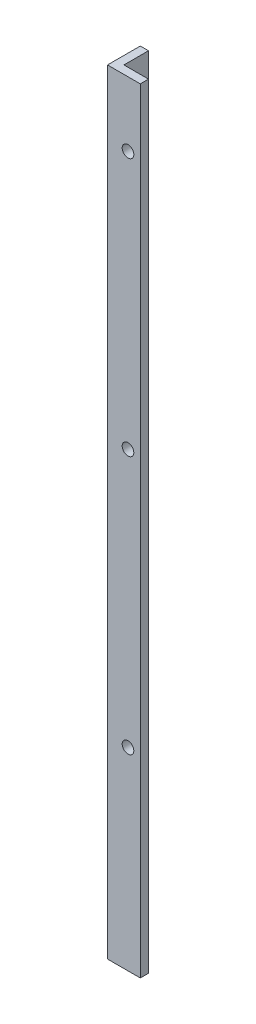
ISO-10303-21;
HEADER;
FILE_DESCRIPTION(('STEP AP214'),'2;1');
FILE_NAME('part.step','',(''),(''),'','','');
FILE_SCHEMA(('AUTOMOTIVE_DESIGN { 1 0 10303 214 1 1 1 1 }'));
ENDSEC;
DATA;
#1=APPLICATION_CONTEXT('core data for automotive mechanical design processes');
#2=APPLICATION_PROTOCOL_DEFINITION('international standard','automotive_design',2000,#1);
#3=PRODUCT_CONTEXT('',#1,'mechanical');
#4=PRODUCT('Part','Part','',(#3));
#5=PRODUCT_RELATED_PRODUCT_CATEGORY('part','',(#4));
#6=PRODUCT_DEFINITION_FORMATION('','',#4);
#7=PRODUCT_DEFINITION_CONTEXT('part definition',#1,'design');
#8=PRODUCT_DEFINITION('design','',#6,#7);
#9=PRODUCT_DEFINITION_SHAPE('','',#8);
#10=(LENGTH_UNIT() NAMED_UNIT(*) SI_UNIT(.MILLI.,.METRE.));
#11=(NAMED_UNIT(*) PLANE_ANGLE_UNIT() SI_UNIT($,.RADIAN.));
#12=(NAMED_UNIT(*) SI_UNIT($,.STERADIAN.) SOLID_ANGLE_UNIT());
#13=UNCERTAINTY_MEASURE_WITH_UNIT(LENGTH_MEASURE(1.E-05),#10,'distance_accuracy_value','');
#14=(GEOMETRIC_REPRESENTATION_CONTEXT(3) GLOBAL_UNCERTAINTY_ASSIGNED_CONTEXT((#13)) GLOBAL_UNIT_ASSIGNED_CONTEXT((#10,
#11,#12)) REPRESENTATION_CONTEXT('',''));
#15=CARTESIAN_POINT('',(0.,0.,0.));
#16=DIRECTION('',(0.,0.,1.));
#17=DIRECTION('',(1.,0.,0.));
#18=AXIS2_PLACEMENT_3D('',#15,#16,#17);
#19=CARTESIAN_POINT('',(0.,300.,0.));
#20=DIRECTION('',(1.,0.,0.));
#21=DIRECTION('',(0.,0.,-1.));
#22=AXIS2_PLACEMENT_3D('',#19,#20,#21);
#23=PLANE('',#22);
#24=CARTESIAN_POINT('',(0.,253.6,-7.94));
#25=DIRECTION('',(-1.,0.,0.));
#26=DIRECTION('',(0.,0.,1.));
#27=AXIS2_PLACEMENT_3D('',#24,#25,#26);
#28=CIRCLE('',#27,1.85000000000001);
#29=CARTESIAN_POINT('',(0.,253.6,-6.08999999999998));
#30=VERTEX_POINT('',#29);
#31=EDGE_CURVE('E178',#30,#30,#28,.T.);
#32=ORIENTED_EDGE('',*,*,#31,.F.);
#33=EDGE_LOOP('',(#32));
#34=FACE_BOUND('',#33,.T.);
#35=CARTESIAN_POINT('',(0.,225.,-7.94000000000001));
#36=DIRECTION('',(1.,0.,0.));
#37=DIRECTION('',(0.,0.,-1.));
#38=AXIS2_PLACEMENT_3D('',#35,#36,#37);
#39=CIRCLE('',#38,2.25);
#40=CARTESIAN_POINT('',(0.,225.,-10.19));
#41=VERTEX_POINT('',#40);
#42=EDGE_CURVE('E182',#41,#41,#39,.T.);
#43=ORIENTED_EDGE('',*,*,#42,.T.);
#44=EDGE_LOOP('',(#43));
#45=FACE_BOUND('',#44,.T.);
#46=CARTESIAN_POINT('',(0.,125.,-7.94000000000001));
#47=DIRECTION('',(1.,0.,0.));
#48=DIRECTION('',(0.,0.,-1.));
#49=AXIS2_PLACEMENT_3D('',#46,#47,#48);
#50=CIRCLE('',#49,2.25);
#51=CARTESIAN_POINT('',(0.,125.,-10.19));
#52=VERTEX_POINT('',#51);
#53=EDGE_CURVE('E186',#52,#52,#50,.T.);
#54=ORIENTED_EDGE('',*,*,#53,.T.);
#55=EDGE_LOOP('',(#54));
#56=FACE_BOUND('',#55,.T.);
#57=CARTESIAN_POINT('',(0.,25.,-7.94000000000001));
#58=DIRECTION('',(1.,0.,0.));
#59=DIRECTION('',(0.,0.,-1.));
#60=AXIS2_PLACEMENT_3D('',#57,#58,#59);
#61=CIRCLE('',#60,2.25);
#62=CARTESIAN_POINT('',(0.,25.,-10.19));
#63=VERTEX_POINT('',#62);
#64=EDGE_CURVE('E189',#63,#63,#61,.T.);
#65=ORIENTED_EDGE('',*,*,#64,.T.);
#66=EDGE_LOOP('',(#65));
#67=FACE_BOUND('',#66,.T.);
#68=DIRECTION('',(0.,0.,1.));
#69=VECTOR('',#68,1.);
#70=CARTESIAN_POINT('',(0.,0.,0.));
#71=LINE('',#70,#69);
#72=CARTESIAN_POINT('',(0.,0.,-12.7));
#73=VERTEX_POINT('',#72);
#74=CARTESIAN_POINT('',(0.,0.,0.));
#75=VERTEX_POINT('',#74);
#76=EDGE_CURVE('E130',#73,#75,#71,.T.);
#77=ORIENTED_EDGE('',*,*,#76,.T.);
#78=DIRECTION('',(0.,-1.,0.));
#79=VECTOR('',#78,1.);
#80=CARTESIAN_POINT('',(0.,300.,0.));
#81=LINE('',#80,#79);
#82=CARTESIAN_POINT('',(0.,300.,0.));
#83=VERTEX_POINT('',#82);
#84=EDGE_CURVE('E11',#83,#75,#81,.T.);
#85=ORIENTED_EDGE('',*,*,#84,.F.);
#86=DIRECTION('',(0.,0.,1.));
#87=VECTOR('',#86,1.);
#88=CARTESIAN_POINT('',(0.,300.,0.));
#89=LINE('',#88,#87);
#90=CARTESIAN_POINT('',(0.,300.,-12.7));
#91=VERTEX_POINT('',#90);
#92=EDGE_CURVE('E141',#91,#83,#89,.T.);
#93=ORIENTED_EDGE('',*,*,#92,.F.);
#94=DIRECTION('',(0.,-1.,0.));
#95=VECTOR('',#94,1.);
#96=CARTESIAN_POINT('',(0.,300.,-12.7));
#97=LINE('',#96,#95);
#98=EDGE_CURVE('E126',#91,#73,#97,.T.);
#99=ORIENTED_EDGE('',*,*,#98,.T.);
#100=EDGE_LOOP('',(#77,#85,#93,#99));
#101=FACE_BOUND('',#100,.T.);
#102=ADVANCED_FACE('F45',(#34,#45,#56,#67,#101),#23,.F.);
#103=CARTESIAN_POINT('',(0.,300.,0.));
#104=DIRECTION('',(0.,0.,-1.));
#105=DIRECTION('',(-1.,0.,0.));
#106=AXIS2_PLACEMENT_3D('',#103,#104,#105);
#107=PLANE('',#106);
#108=CARTESIAN_POINT('',(7.94,275.,0.));
#109=DIRECTION('',(0.,0.,-1.));
#110=DIRECTION('',(-1.,0.,0.));
#111=AXIS2_PLACEMENT_3D('',#108,#109,#110);
#112=CIRCLE('',#111,2.25);
#113=CARTESIAN_POINT('',(5.68999999999999,275.,0.));
#114=VERTEX_POINT('',#113);
#115=EDGE_CURVE('E134',#114,#114,#112,.T.);
#116=ORIENTED_EDGE('',*,*,#115,.T.);
#117=EDGE_LOOP('',(#116));
#118=FACE_BOUND('',#117,.T.);
#119=CARTESIAN_POINT('',(7.94,175.,0.));
#120=DIRECTION('',(0.,0.,-1.));
#121=DIRECTION('',(-1.,0.,0.));
#122=AXIS2_PLACEMENT_3D('',#119,#120,#121);
#123=CIRCLE('',#122,2.25);
#124=CARTESIAN_POINT('',(5.68999999999999,175.,0.));
#125=VERTEX_POINT('',#124);
#126=EDGE_CURVE('E214',#125,#125,#123,.T.);
#127=ORIENTED_EDGE('',*,*,#126,.T.);
#128=EDGE_LOOP('',(#127));
#129=FACE_BOUND('',#128,.T.);
#130=CARTESIAN_POINT('',(7.94,75.,0.));
#131=DIRECTION('',(0.,0.,-1.));
#132=DIRECTION('',(-1.,0.,0.));
#133=AXIS2_PLACEMENT_3D('',#130,#131,#132);
#134=CIRCLE('',#133,2.25);
#135=CARTESIAN_POINT('',(5.68999999999999,75.,0.));
#136=VERTEX_POINT('',#135);
#137=EDGE_CURVE('E206',#136,#136,#134,.T.);
#138=ORIENTED_EDGE('',*,*,#137,.T.);
#139=EDGE_LOOP('',(#138));
#140=FACE_BOUND('',#139,.T.);
#141=DIRECTION('',(1.,0.,0.));
#142=VECTOR('',#141,1.);
#143=CARTESIAN_POINT('',(0.,0.,0.));
#144=LINE('',#143,#142);
#145=CARTESIAN_POINT('',(12.7,0.,0.));
#146=VERTEX_POINT('',#145);
#147=EDGE_CURVE('E133',#75,#146,#144,.T.);
#148=ORIENTED_EDGE('',*,*,#147,.T.);
#149=DIRECTION('',(0.,-1.,0.));
#150=VECTOR('',#149,1.);
#151=CARTESIAN_POINT('',(12.7,300.,0.));
#152=LINE('',#151,#150);
#153=CARTESIAN_POINT('',(12.7,300.,0.));
#154=VERTEX_POINT('',#153);
#155=EDGE_CURVE('E54',#154,#146,#152,.T.);
#156=ORIENTED_EDGE('',*,*,#155,.F.);
#157=DIRECTION('',(1.,0.,0.));
#158=VECTOR('',#157,1.);
#159=CARTESIAN_POINT('',(0.,300.,0.));
#160=LINE('',#159,#158);
#161=EDGE_CURVE('E99',#83,#154,#160,.T.);
#162=ORIENTED_EDGE('',*,*,#161,.F.);
#163=ORIENTED_EDGE('',*,*,#84,.T.);
#164=EDGE_LOOP('',(#148,#156,#162,#163));
#165=FACE_BOUND('',#164,.T.);
#166=ADVANCED_FACE('F168',(#118,#129,#140,#165),#107,.F.);
#167=CARTESIAN_POINT('',(12.7,300.,0.));
#168=DIRECTION('',(-1.,0.,0.));
#169=DIRECTION('',(0.,0.,1.));
#170=AXIS2_PLACEMENT_3D('',#167,#168,#169);
#171=PLANE('',#170);
#172=DIRECTION('',(0.,0.,-1.));
#173=VECTOR('',#172,1.);
#174=CARTESIAN_POINT('',(12.7,0.,0.));
#175=LINE('',#174,#173);
#176=CARTESIAN_POINT('',(12.7,0.,-3.18));
#177=VERTEX_POINT('',#176);
#178=EDGE_CURVE('E136',#146,#177,#175,.T.);
#179=ORIENTED_EDGE('',*,*,#178,.T.);
#180=DIRECTION('',(0.,-1.,0.));
#181=VECTOR('',#180,1.);
#182=CARTESIAN_POINT('',(12.7,300.,-3.18));
#183=LINE('',#182,#181);
#184=CARTESIAN_POINT('',(12.7,300.,-3.18));
#185=VERTEX_POINT('',#184);
#186=EDGE_CURVE('E121',#185,#177,#183,.T.);
#187=ORIENTED_EDGE('',*,*,#186,.F.);
#188=DIRECTION('',(0.,0.,-1.));
#189=VECTOR('',#188,1.);
#190=CARTESIAN_POINT('',(12.7,300.,0.));
#191=LINE('',#190,#189);
#192=EDGE_CURVE('E112',#154,#185,#191,.T.);
#193=ORIENTED_EDGE('',*,*,#192,.F.);
#194=ORIENTED_EDGE('',*,*,#155,.T.);
#195=EDGE_LOOP('',(#179,#187,#193,#194));
#196=FACE_BOUND('',#195,.T.);
#197=ADVANCED_FACE('F148',(#196),#171,.F.);
#198=CARTESIAN_POINT('',(3.18,300.,-3.18));
#199=DIRECTION('',(0.,0.,1.));
#200=DIRECTION('',(1.,0.,0.));
#201=AXIS2_PLACEMENT_3D('',#198,#199,#200);
#202=PLANE('',#201);
#203=CARTESIAN_POINT('',(7.94,275.,-3.18));
#204=DIRECTION('',(0.,0.,-1.));
#205=DIRECTION('',(-1.,0.,0.));
#206=AXIS2_PLACEMENT_3D('',#203,#204,#205);
#207=CIRCLE('',#206,2.25);
#208=CARTESIAN_POINT('',(5.68999999999999,275.,-3.18));
#209=VERTEX_POINT('',#208);
#210=EDGE_CURVE('E203',#209,#209,#207,.T.);
#211=ORIENTED_EDGE('',*,*,#210,.F.);
#212=EDGE_LOOP('',(#211));
#213=FACE_BOUND('',#212,.T.);
#214=CARTESIAN_POINT('',(7.94,175.,-3.18));
#215=DIRECTION('',(0.,0.,-1.));
#216=DIRECTION('',(-1.,0.,0.));
#217=AXIS2_PLACEMENT_3D('',#214,#215,#216);
#218=CIRCLE('',#217,2.25);
#219=CARTESIAN_POINT('',(5.68999999999999,175.,-3.18));
#220=VERTEX_POINT('',#219);
#221=EDGE_CURVE('E207',#220,#220,#218,.T.);
#222=ORIENTED_EDGE('',*,*,#221,.F.);
#223=EDGE_LOOP('',(#222));
#224=FACE_BOUND('',#223,.T.);
#225=CARTESIAN_POINT('',(7.94,75.,-3.18));
#226=DIRECTION('',(0.,0.,-1.));
#227=DIRECTION('',(-1.,0.,0.));
#228=AXIS2_PLACEMENT_3D('',#225,#226,#227);
#229=CIRCLE('',#228,2.25);
#230=CARTESIAN_POINT('',(5.68999999999999,75.,-3.18));
#231=VERTEX_POINT('',#230);
#232=EDGE_CURVE('E202',#231,#231,#229,.T.);
#233=ORIENTED_EDGE('',*,*,#232,.F.);
#234=EDGE_LOOP('',(#233));
#235=FACE_BOUND('',#234,.T.);
#236=DIRECTION('',(-1.,0.,0.));
#237=VECTOR('',#236,1.);
#238=CARTESIAN_POINT('',(3.18,0.,-3.18));
#239=LINE('',#238,#237);
#240=CARTESIAN_POINT('',(3.18,0.,-3.18));
#241=VERTEX_POINT('',#240);
#242=EDGE_CURVE('E120',#177,#241,#239,.T.);
#243=ORIENTED_EDGE('',*,*,#242,.T.);
#244=DIRECTION('',(0.,-1.,0.));
#245=VECTOR('',#244,1.);
#246=CARTESIAN_POINT('',(3.18,300.,-3.18));
#247=LINE('',#246,#245);
#248=CARTESIAN_POINT('',(3.18,300.,-3.18));
#249=VERTEX_POINT('',#248);
#250=EDGE_CURVE('E117',#249,#241,#247,.T.);
#251=ORIENTED_EDGE('',*,*,#250,.F.);
#252=DIRECTION('',(-1.,0.,0.));
#253=VECTOR('',#252,1.);
#254=CARTESIAN_POINT('',(3.18,300.,-3.18));
#255=LINE('',#254,#253);
#256=EDGE_CURVE('E106',#185,#249,#255,.T.);
#257=ORIENTED_EDGE('',*,*,#256,.F.);
#258=ORIENTED_EDGE('',*,*,#186,.T.);
#259=EDGE_LOOP('',(#243,#251,#257,#258));
#260=FACE_BOUND('',#259,.T.);
#261=ADVANCED_FACE('F118',(#213,#224,#235,#260),#202,.F.);
#262=CARTESIAN_POINT('',(3.18,300.,-3.18));
#263=DIRECTION('',(-1.,0.,0.));
#264=DIRECTION('',(0.,0.,1.));
#265=AXIS2_PLACEMENT_3D('',#262,#263,#264);
#266=PLANE('',#265);
#267=CARTESIAN_POINT('',(3.18,253.6,-7.94));
#268=DIRECTION('',(-1.,0.,0.));
#269=DIRECTION('',(0.,0.,1.));
#270=AXIS2_PLACEMENT_3D('',#267,#268,#269);
#271=CIRCLE('',#270,1.85000000000001);
#272=CARTESIAN_POINT('',(3.18,253.6,-6.08999999999998));
#273=VERTEX_POINT('',#272);
#274=EDGE_CURVE('E48',#273,#273,#271,.T.);
#275=ORIENTED_EDGE('',*,*,#274,.T.);
#276=EDGE_LOOP('',(#275));
#277=FACE_BOUND('',#276,.T.);
#278=CARTESIAN_POINT('',(3.18,225.,-7.94000000000001));
#279=DIRECTION('',(1.,0.,0.));
#280=DIRECTION('',(0.,0.,-1.));
#281=AXIS2_PLACEMENT_3D('',#278,#279,#280);
#282=CIRCLE('',#281,2.25);
#283=CARTESIAN_POINT('',(3.18,225.,-10.19));
#284=VERTEX_POINT('',#283);
#285=EDGE_CURVE('E191',#284,#284,#282,.T.);
#286=ORIENTED_EDGE('',*,*,#285,.F.);
#287=EDGE_LOOP('',(#286));
#288=FACE_BOUND('',#287,.T.);
#289=CARTESIAN_POINT('',(3.18,125.,-7.94000000000001));
#290=DIRECTION('',(1.,0.,0.));
#291=DIRECTION('',(0.,0.,-1.));
#292=AXIS2_PLACEMENT_3D('',#289,#290,#291);
#293=CIRCLE('',#292,2.25);
#294=CARTESIAN_POINT('',(3.18,125.,-10.19));
#295=VERTEX_POINT('',#294);
#296=EDGE_CURVE('E195',#295,#295,#293,.T.);
#297=ORIENTED_EDGE('',*,*,#296,.F.);
#298=EDGE_LOOP('',(#297));
#299=FACE_BOUND('',#298,.T.);
#300=CARTESIAN_POINT('',(3.18,25.,-7.94000000000001));
#301=DIRECTION('',(1.,0.,0.));
#302=DIRECTION('',(0.,0.,-1.));
#303=AXIS2_PLACEMENT_3D('',#300,#301,#302);
#304=CIRCLE('',#303,2.25);
#305=CARTESIAN_POINT('',(3.18,25.,-10.19));
#306=VERTEX_POINT('',#305);
#307=EDGE_CURVE('E198',#306,#306,#304,.T.);
#308=ORIENTED_EDGE('',*,*,#307,.F.);
#309=EDGE_LOOP('',(#308));
#310=FACE_BOUND('',#309,.T.);
#311=DIRECTION('',(0.,0.,-1.));
#312=VECTOR('',#311,1.);
#313=CARTESIAN_POINT('',(3.18,0.,-3.18));
#314=LINE('',#313,#312);
#315=CARTESIAN_POINT('',(3.18,0.,-12.7));
#316=VERTEX_POINT('',#315);
#317=EDGE_CURVE('E85',#241,#316,#314,.T.);
#318=ORIENTED_EDGE('',*,*,#317,.T.);
#319=DIRECTION('',(0.,-1.,0.));
#320=VECTOR('',#319,1.);
#321=CARTESIAN_POINT('',(3.18,300.,-12.7));
#322=LINE('',#321,#320);
#323=CARTESIAN_POINT('',(3.18,300.,-12.7));
#324=VERTEX_POINT('',#323);
#325=EDGE_CURVE('E122',#324,#316,#322,.T.);
#326=ORIENTED_EDGE('',*,*,#325,.F.);
#327=DIRECTION('',(0.,0.,-1.));
#328=VECTOR('',#327,1.);
#329=CARTESIAN_POINT('',(3.18,300.,-3.18));
#330=LINE('',#329,#328);
#331=EDGE_CURVE('E110',#249,#324,#330,.T.);
#332=ORIENTED_EDGE('',*,*,#331,.F.);
#333=ORIENTED_EDGE('',*,*,#250,.T.);
#334=EDGE_LOOP('',(#318,#326,#332,#333));
#335=FACE_BOUND('',#334,.T.);
#336=ADVANCED_FACE('F124',(#277,#288,#299,#310,#335),#266,.F.);
#337=CARTESIAN_POINT('',(0.,300.,-12.7));
#338=DIRECTION('',(0.,0.,1.));
#339=DIRECTION('',(1.,0.,0.));
#340=AXIS2_PLACEMENT_3D('',#337,#338,#339);
#341=PLANE('',#340);
#342=DIRECTION('',(-1.,0.,0.));
#343=VECTOR('',#342,1.);
#344=CARTESIAN_POINT('',(0.,0.,-12.7));
#345=LINE('',#344,#343);
#346=EDGE_CURVE('E91',#316,#73,#345,.T.);
#347=ORIENTED_EDGE('',*,*,#346,.T.);
#348=ORIENTED_EDGE('',*,*,#98,.F.);
#349=DIRECTION('',(-1.,0.,0.));
#350=VECTOR('',#349,1.);
#351=CARTESIAN_POINT('',(0.,300.,-12.7));
#352=LINE('',#351,#350);
#353=EDGE_CURVE('E62',#324,#91,#352,.T.);
#354=ORIENTED_EDGE('',*,*,#353,.F.);
#355=ORIENTED_EDGE('',*,*,#325,.T.);
#356=EDGE_LOOP('',(#347,#348,#354,#355));
#357=FACE_BOUND('',#356,.T.);
#358=ADVANCED_FACE('F155',(#357),#341,.F.);
#359=CARTESIAN_POINT('',(0.,300.,0.));
#360=DIRECTION('',(0.,-1.,0.));
#361=DIRECTION('',(0.,0.,-1.));
#362=AXIS2_PLACEMENT_3D('',#359,#360,#361);
#363=PLANE('',#362);
#364=ORIENTED_EDGE('',*,*,#92,.T.);
#365=ORIENTED_EDGE('',*,*,#161,.T.);
#366=ORIENTED_EDGE('',*,*,#192,.T.);
#367=ORIENTED_EDGE('',*,*,#256,.T.);
#368=ORIENTED_EDGE('',*,*,#331,.T.);
#369=ORIENTED_EDGE('',*,*,#353,.T.);
#370=EDGE_LOOP('',(#364,#365,#366,#367,#368,#369));
#371=FACE_BOUND('',#370,.T.);
#372=ADVANCED_FACE('F108',(#371),#363,.F.);
#373=CARTESIAN_POINT('',(0.,0.,0.));
#374=DIRECTION('',(0.,-1.,0.));
#375=DIRECTION('',(0.,0.,-1.));
#376=AXIS2_PLACEMENT_3D('',#373,#374,#375);
#377=PLANE('',#376);
#378=ORIENTED_EDGE('',*,*,#76,.F.);
#379=ORIENTED_EDGE('',*,*,#346,.F.);
#380=ORIENTED_EDGE('',*,*,#317,.F.);
#381=ORIENTED_EDGE('',*,*,#242,.F.);
#382=ORIENTED_EDGE('',*,*,#178,.F.);
#383=ORIENTED_EDGE('',*,*,#147,.F.);
#384=EDGE_LOOP('',(#378,#379,#380,#381,#382,#383));
#385=FACE_BOUND('',#384,.T.);
#386=ADVANCED_FACE('F151',(#385),#377,.T.);
#387=CARTESIAN_POINT('',(7.94,75.,6.82));
#388=DIRECTION('',(0.,0.,-1.));
#389=DIRECTION('',(-1.,0.,0.));
#390=AXIS2_PLACEMENT_3D('',#387,#388,#389);
#391=CYLINDRICAL_SURFACE('',#390,2.25);
#392=ORIENTED_EDGE('',*,*,#232,.T.);
#393=EDGE_LOOP('',(#392));
#394=FACE_BOUND('',#393,.T.);
#395=ORIENTED_EDGE('',*,*,#137,.F.);
#396=EDGE_LOOP('',(#395));
#397=FACE_BOUND('',#396,.T.);
#398=ADVANCED_FACE('F236',(#394,#397),#391,.F.);
#399=CARTESIAN_POINT('',(7.94,175.,6.82));
#400=DIRECTION('',(0.,0.,-1.));
#401=DIRECTION('',(-1.,0.,0.));
#402=AXIS2_PLACEMENT_3D('',#399,#400,#401);
#403=CYLINDRICAL_SURFACE('',#402,2.25);
#404=ORIENTED_EDGE('',*,*,#221,.T.);
#405=EDGE_LOOP('',(#404));
#406=FACE_BOUND('',#405,.T.);
#407=ORIENTED_EDGE('',*,*,#126,.F.);
#408=EDGE_LOOP('',(#407));
#409=FACE_BOUND('',#408,.T.);
#410=ADVANCED_FACE('F226',(#406,#409),#403,.F.);
#411=CARTESIAN_POINT('',(7.94,275.,6.82));
#412=DIRECTION('',(0.,0.,-1.));
#413=DIRECTION('',(-1.,0.,0.));
#414=AXIS2_PLACEMENT_3D('',#411,#412,#413);
#415=CYLINDRICAL_SURFACE('',#414,2.25);
#416=ORIENTED_EDGE('',*,*,#210,.T.);
#417=EDGE_LOOP('',(#416));
#418=FACE_BOUND('',#417,.T.);
#419=ORIENTED_EDGE('',*,*,#115,.F.);
#420=EDGE_LOOP('',(#419));
#421=FACE_BOUND('',#420,.T.);
#422=ADVANCED_FACE('F223',(#418,#421),#415,.F.);
#423=CARTESIAN_POINT('',(-6.82,25.,-7.94000000000001));
#424=DIRECTION('',(1.,0.,0.));
#425=DIRECTION('',(0.,0.,-1.));
#426=AXIS2_PLACEMENT_3D('',#423,#424,#425);
#427=CYLINDRICAL_SURFACE('',#426,2.25);
#428=ORIENTED_EDGE('',*,*,#307,.T.);
#429=EDGE_LOOP('',(#428));
#430=FACE_BOUND('',#429,.T.);
#431=ORIENTED_EDGE('',*,*,#64,.F.);
#432=EDGE_LOOP('',(#431));
#433=FACE_BOUND('',#432,.T.);
#434=ADVANCED_FACE('F225',(#430,#433),#427,.F.);
#435=CARTESIAN_POINT('',(-6.82,125.,-7.94000000000001));
#436=DIRECTION('',(1.,0.,0.));
#437=DIRECTION('',(0.,0.,-1.));
#438=AXIS2_PLACEMENT_3D('',#435,#436,#437);
#439=CYLINDRICAL_SURFACE('',#438,2.25);
#440=ORIENTED_EDGE('',*,*,#296,.T.);
#441=EDGE_LOOP('',(#440));
#442=FACE_BOUND('',#441,.T.);
#443=ORIENTED_EDGE('',*,*,#53,.F.);
#444=EDGE_LOOP('',(#443));
#445=FACE_BOUND('',#444,.T.);
#446=ADVANCED_FACE('F233',(#442,#445),#439,.F.);
#447=CARTESIAN_POINT('',(-6.82,225.,-7.94000000000001));
#448=DIRECTION('',(1.,0.,0.));
#449=DIRECTION('',(0.,0.,-1.));
#450=AXIS2_PLACEMENT_3D('',#447,#448,#449);
#451=CYLINDRICAL_SURFACE('',#450,2.25);
#452=ORIENTED_EDGE('',*,*,#285,.T.);
#453=EDGE_LOOP('',(#452));
#454=FACE_BOUND('',#453,.T.);
#455=ORIENTED_EDGE('',*,*,#42,.F.);
#456=EDGE_LOOP('',(#455));
#457=FACE_BOUND('',#456,.T.);
#458=ADVANCED_FACE('F279',(#454,#457),#451,.F.);
#459=CARTESIAN_POINT('',(12.7,253.6,-7.94));
#460=DIRECTION('',(-1.,0.,0.));
#461=DIRECTION('',(0.,0.,1.));
#462=AXIS2_PLACEMENT_3D('',#459,#460,#461);
#463=CYLINDRICAL_SURFACE('',#462,1.85000000000001);
#464=ORIENTED_EDGE('',*,*,#31,.T.);
#465=EDGE_LOOP('',(#464));
#466=FACE_BOUND('',#465,.T.);
#467=ORIENTED_EDGE('',*,*,#274,.F.);
#468=EDGE_LOOP('',(#467));
#469=FACE_BOUND('',#468,.T.);
#470=ADVANCED_FACE('F288',(#466,#469),#463,.F.);
#471=CLOSED_SHELL('',(#102,#166,#197,#261,#336,#358,#372,#386,#398,#410,#422,#434,#446,#458,#470));
#472=MANIFOLD_SOLID_BREP('B2',#471);
#473=ADVANCED_BREP_SHAPE_REPRESENTATION('',(#18,#472),#14);
#474=SHAPE_DEFINITION_REPRESENTATION(#9,#473);
ENDSEC;
END-ISO-10303-21;
